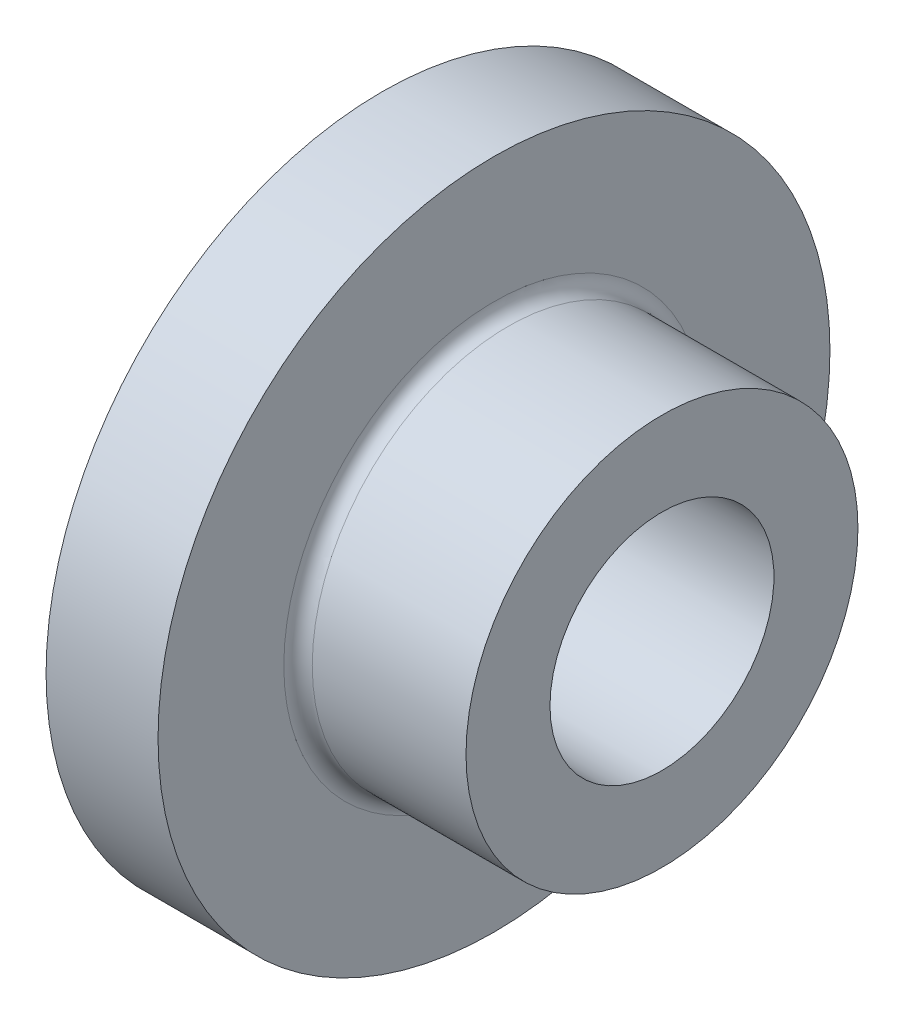
ISO-10303-21;
HEADER;
FILE_DESCRIPTION(('STEP AP214'),'2;1');
FILE_NAME('part.step','',(''),(''),'','','');
FILE_SCHEMA(('AUTOMOTIVE_DESIGN { 1 0 10303 214 1 1 1 1 }'));
ENDSEC;
DATA;
#1=APPLICATION_CONTEXT('core data for automotive mechanical design processes');
#2=APPLICATION_PROTOCOL_DEFINITION('international standard','automotive_design',2000,#1);
#3=PRODUCT_CONTEXT('',#1,'mechanical');
#4=PRODUCT('Part','Part','',(#3));
#5=PRODUCT_RELATED_PRODUCT_CATEGORY('part','',(#4));
#6=PRODUCT_DEFINITION_FORMATION('','',#4);
#7=PRODUCT_DEFINITION_CONTEXT('part definition',#1,'design');
#8=PRODUCT_DEFINITION('design','',#6,#7);
#9=PRODUCT_DEFINITION_SHAPE('','',#8);
#10=(LENGTH_UNIT() NAMED_UNIT(*) SI_UNIT(.MILLI.,.METRE.));
#11=(NAMED_UNIT(*) PLANE_ANGLE_UNIT() SI_UNIT($,.RADIAN.));
#12=(NAMED_UNIT(*) SI_UNIT($,.STERADIAN.) SOLID_ANGLE_UNIT());
#13=UNCERTAINTY_MEASURE_WITH_UNIT(LENGTH_MEASURE(1.E-05),#10,'distance_accuracy_value','');
#14=(GEOMETRIC_REPRESENTATION_CONTEXT(3) GLOBAL_UNCERTAINTY_ASSIGNED_CONTEXT((#13)) GLOBAL_UNIT_ASSIGNED_CONTEXT((#10,
#11,#12)) REPRESENTATION_CONTEXT('',''));
#15=CARTESIAN_POINT('',(0.,0.,0.));
#16=DIRECTION('',(0.,0.,1.));
#17=DIRECTION('',(1.,0.,0.));
#18=AXIS2_PLACEMENT_3D('',#15,#16,#17);
#19=CARTESIAN_POINT('',(0.,0.,0.));
#20=DIRECTION('',(-1.,0.,0.));
#21=DIRECTION('',(0.,0.,1.));
#22=AXIS2_PLACEMENT_3D('',#19,#20,#21);
#23=CYLINDRICAL_SURFACE('',#22,2.);
#24=CARTESIAN_POINT('',(5.,0.,0.));
#25=DIRECTION('',(-1.,0.,0.));
#26=DIRECTION('',(0.,0.,1.));
#27=AXIS2_PLACEMENT_3D('',#24,#25,#26);
#28=CIRCLE('',#27,2.);
#29=CARTESIAN_POINT('',(5.,0.,2.));
#30=VERTEX_POINT('',#29);
#31=EDGE_CURVE('E76',#30,#30,#28,.T.);
#32=ORIENTED_EDGE('',*,*,#31,.F.);
#33=EDGE_LOOP('',(#32));
#34=FACE_BOUND('',#33,.T.);
#35=CARTESIAN_POINT('',(0.,0.,0.));
#36=DIRECTION('',(-1.,0.,0.));
#37=DIRECTION('',(0.,0.,1.));
#38=AXIS2_PLACEMENT_3D('',#35,#36,#37);
#39=CIRCLE('',#38,2.);
#40=CARTESIAN_POINT('',(0.,0.,2.));
#41=VERTEX_POINT('',#40);
#42=EDGE_CURVE('E57',#41,#41,#39,.T.);
#43=ORIENTED_EDGE('',*,*,#42,.T.);
#44=EDGE_LOOP('',(#43));
#45=FACE_BOUND('',#44,.T.);
#46=ADVANCED_FACE('F44',(#34,#45),#23,.F.);
#47=CARTESIAN_POINT('',(0.,2.,0.));
#48=DIRECTION('',(1.,0.,0.));
#49=DIRECTION('',(0.,0.,-1.));
#50=AXIS2_PLACEMENT_3D('',#47,#48,#49);
#51=PLANE('',#50);
#52=ORIENTED_EDGE('',*,*,#42,.F.);
#53=EDGE_LOOP('',(#52));
#54=FACE_BOUND('',#53,.T.);
#55=CARTESIAN_POINT('',(0.,0.,0.));
#56=DIRECTION('',(-1.,0.,0.));
#57=DIRECTION('',(0.,0.,1.));
#58=AXIS2_PLACEMENT_3D('',#55,#56,#57);
#59=CIRCLE('',#58,6.);
#60=CARTESIAN_POINT('',(0.,0.,6.));
#61=VERTEX_POINT('',#60);
#62=EDGE_CURVE('E62',#61,#61,#59,.T.);
#63=ORIENTED_EDGE('',*,*,#62,.T.);
#64=EDGE_LOOP('',(#63));
#65=FACE_BOUND('',#64,.T.);
#66=ADVANCED_FACE('F85',(#54,#65),#51,.F.);
#67=CARTESIAN_POINT('',(0.,0.,0.));
#68=DIRECTION('',(-1.,0.,0.));
#69=DIRECTION('',(0.,0.,1.));
#70=AXIS2_PLACEMENT_3D('',#67,#68,#69);
#71=CYLINDRICAL_SURFACE('',#70,6.);
#72=ORIENTED_EDGE('',*,*,#62,.F.);
#73=EDGE_LOOP('',(#72));
#74=FACE_BOUND('',#73,.T.);
#75=CARTESIAN_POINT('',(2.,0.,0.));
#76=DIRECTION('',(-1.,0.,0.));
#77=DIRECTION('',(0.,0.,1.));
#78=AXIS2_PLACEMENT_3D('',#75,#76,#77);
#79=CIRCLE('',#78,6.);
#80=CARTESIAN_POINT('',(2.,0.,6.));
#81=VERTEX_POINT('',#80);
#82=EDGE_CURVE('E68',#81,#81,#79,.T.);
#83=ORIENTED_EDGE('',*,*,#82,.T.);
#84=EDGE_LOOP('',(#83));
#85=FACE_BOUND('',#84,.T.);
#86=ADVANCED_FACE('F90',(#74,#85),#71,.T.);
#87=CARTESIAN_POINT('',(2.,6.,0.));
#88=DIRECTION('',(-1.,0.,0.));
#89=DIRECTION('',(0.,0.,1.));
#90=AXIS2_PLACEMENT_3D('',#87,#88,#89);
#91=PLANE('',#90);
#92=CARTESIAN_POINT('',(2.,0.,0.));
#93=DIRECTION('',(-1.,0.,0.));
#94=DIRECTION('',(0.,0.,1.));
#95=AXIS2_PLACEMENT_3D('',#92,#93,#94);
#96=CIRCLE('',#95,3.754);
#97=CARTESIAN_POINT('',(2.,0.,3.754));
#98=VERTEX_POINT('',#97);
#99=EDGE_CURVE('E52',#98,#98,#96,.T.);
#100=ORIENTED_EDGE('',*,*,#99,.T.);
#101=EDGE_LOOP('',(#100));
#102=FACE_BOUND('',#101,.T.);
#103=ORIENTED_EDGE('',*,*,#82,.F.);
#104=EDGE_LOOP('',(#103));
#105=FACE_BOUND('',#104,.T.);
#106=ADVANCED_FACE('F96',(#102,#105),#91,.F.);
#107=CARTESIAN_POINT('',(0.,0.,0.));
#108=DIRECTION('',(-1.,0.,0.));
#109=DIRECTION('',(0.,0.,1.));
#110=AXIS2_PLACEMENT_3D('',#107,#108,#109);
#111=CYLINDRICAL_SURFACE('',#110,3.5);
#112=CARTESIAN_POINT('',(2.254,0.,0.));
#113=DIRECTION('',(-1.,0.,0.));
#114=DIRECTION('',(0.,0.,1.));
#115=AXIS2_PLACEMENT_3D('',#112,#113,#114);
#116=CIRCLE('',#115,3.5);
#117=CARTESIAN_POINT('',(2.254,0.,3.5));
#118=VERTEX_POINT('',#117);
#119=EDGE_CURVE('E10',#118,#118,#116,.F.);
#120=ORIENTED_EDGE('',*,*,#119,.T.);
#121=EDGE_LOOP('',(#120));
#122=FACE_BOUND('',#121,.T.);
#123=CARTESIAN_POINT('',(5.,0.,0.));
#124=DIRECTION('',(-1.,0.,0.));
#125=DIRECTION('',(0.,0.,1.));
#126=AXIS2_PLACEMENT_3D('',#123,#124,#125);
#127=CIRCLE('',#126,3.5);
#128=CARTESIAN_POINT('',(5.,0.,3.5));
#129=VERTEX_POINT('',#128);
#130=EDGE_CURVE('E72',#129,#129,#127,.T.);
#131=ORIENTED_EDGE('',*,*,#130,.T.);
#132=EDGE_LOOP('',(#131));
#133=FACE_BOUND('',#132,.T.);
#134=ADVANCED_FACE('F101',(#122,#133),#111,.T.);
#135=CARTESIAN_POINT('',(5.,3.5,0.));
#136=DIRECTION('',(-1.,0.,0.));
#137=DIRECTION('',(0.,0.,1.));
#138=AXIS2_PLACEMENT_3D('',#135,#136,#137);
#139=PLANE('',#138);
#140=ORIENTED_EDGE('',*,*,#130,.F.);
#141=EDGE_LOOP('',(#140));
#142=FACE_BOUND('',#141,.T.);
#143=ORIENTED_EDGE('',*,*,#31,.T.);
#144=EDGE_LOOP('',(#143));
#145=FACE_BOUND('',#144,.T.);
#146=ADVANCED_FACE('F81',(#142,#145),#139,.F.);
#147=CARTESIAN_POINT('',(2.254,0.,0.));
#148=DIRECTION('',(-1.,0.,0.));
#149=DIRECTION('',(0.,0.,1.));
#150=AXIS2_PLACEMENT_3D('',#147,#148,#149);
#151=TOROIDAL_SURFACE('',#150,3.754,0.254);
#152=ORIENTED_EDGE('',*,*,#119,.F.);
#153=EDGE_LOOP('',(#152));
#154=FACE_BOUND('',#153,.T.);
#155=ORIENTED_EDGE('',*,*,#99,.F.);
#156=EDGE_LOOP('',(#155));
#157=FACE_BOUND('',#156,.T.);
#158=ADVANCED_FACE('F46',(#154,#157),#151,.F.);
#159=CLOSED_SHELL('',(#46,#66,#86,#106,#134,#146,#158));
#160=MANIFOLD_SOLID_BREP('B2',#159);
#161=ADVANCED_BREP_SHAPE_REPRESENTATION('',(#18,#160),#14);
#162=SHAPE_DEFINITION_REPRESENTATION(#9,#161);
ENDSEC;
END-ISO-10303-21;
